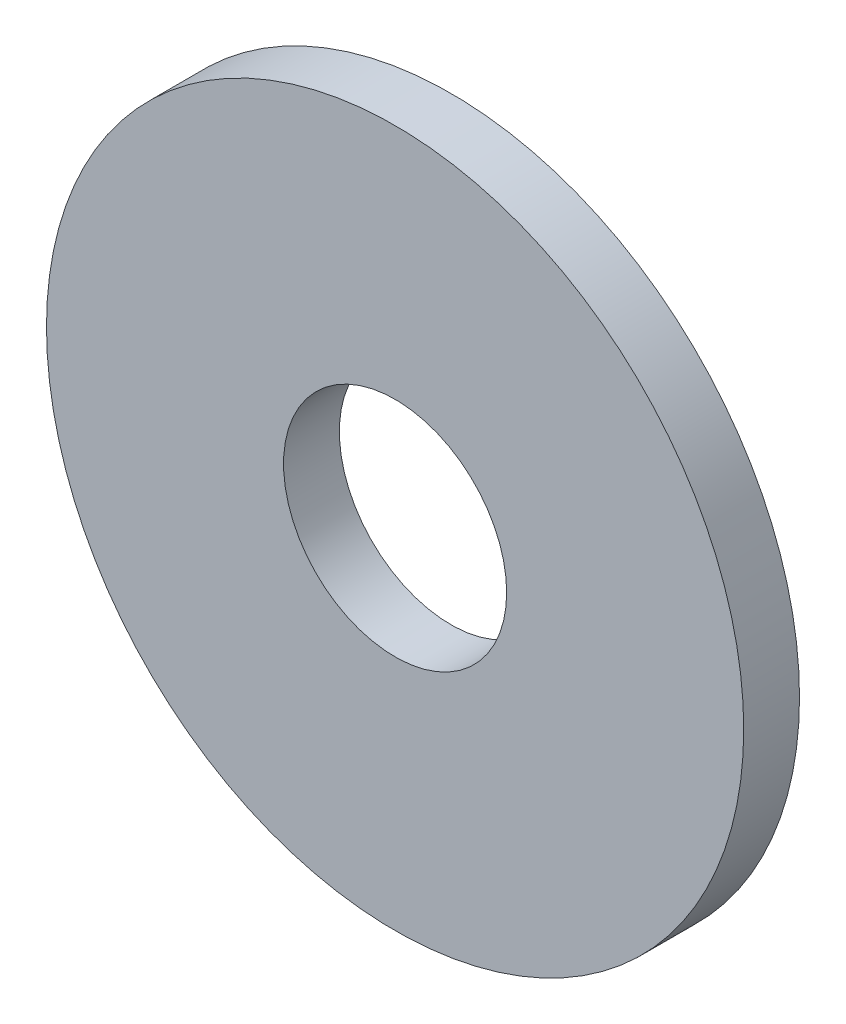
ISO-10303-21;
HEADER;
FILE_DESCRIPTION(('STEP AP214'),'2;1');
FILE_NAME('part.step','',(''),(''),'','','');
FILE_SCHEMA(('AUTOMOTIVE_DESIGN { 1 0 10303 214 1 1 1 1 }'));
ENDSEC;
DATA;
#1=APPLICATION_CONTEXT('core data for automotive mechanical design processes');
#2=APPLICATION_PROTOCOL_DEFINITION('international standard','automotive_design',2000,#1);
#3=PRODUCT_CONTEXT('',#1,'mechanical');
#4=PRODUCT('Part','Part','',(#3));
#5=PRODUCT_RELATED_PRODUCT_CATEGORY('part','',(#4));
#6=PRODUCT_DEFINITION_FORMATION('','',#4);
#7=PRODUCT_DEFINITION_CONTEXT('part definition',#1,'design');
#8=PRODUCT_DEFINITION('design','',#6,#7);
#9=PRODUCT_DEFINITION_SHAPE('','',#8);
#10=(LENGTH_UNIT() NAMED_UNIT(*) SI_UNIT(.MILLI.,.METRE.));
#11=(NAMED_UNIT(*) PLANE_ANGLE_UNIT() SI_UNIT($,.RADIAN.));
#12=(NAMED_UNIT(*) SI_UNIT($,.STERADIAN.) SOLID_ANGLE_UNIT());
#13=UNCERTAINTY_MEASURE_WITH_UNIT(LENGTH_MEASURE(1.E-05),#10,'distance_accuracy_value','');
#14=(GEOMETRIC_REPRESENTATION_CONTEXT(3) GLOBAL_UNCERTAINTY_ASSIGNED_CONTEXT((#13)) GLOBAL_UNIT_ASSIGNED_CONTEXT((#10,
#11,#12)) REPRESENTATION_CONTEXT('',''));
#15=CARTESIAN_POINT('',(0.,0.,0.));
#16=DIRECTION('',(0.,0.,1.));
#17=DIRECTION('',(1.,0.,0.));
#18=AXIS2_PLACEMENT_3D('',#15,#16,#17);
#19=CARTESIAN_POINT('',(0.,0.,0.8));
#20=DIRECTION('',(0.,0.,1.));
#21=DIRECTION('',(1.,0.,0.));
#22=AXIS2_PLACEMENT_3D('',#19,#20,#21);
#23=PLANE('',#22);
#24=CARTESIAN_POINT('',(0.,0.,0.8));
#25=DIRECTION('',(0.,0.,1.));
#26=DIRECTION('',(1.,0.,0.));
#27=AXIS2_PLACEMENT_3D('',#24,#25,#26);
#28=CIRCLE('',#27,5.);
#29=CARTESIAN_POINT('',(5.,0.,0.8));
#30=VERTEX_POINT('',#29);
#31=EDGE_CURVE('E10',#30,#30,#28,.T.);
#32=ORIENTED_EDGE('',*,*,#31,.T.);
#33=EDGE_LOOP('',(#32));
#34=FACE_BOUND('',#33,.T.);
#35=CARTESIAN_POINT('',(0.,0.,0.8));
#36=DIRECTION('',(0.,0.,1.));
#37=DIRECTION('',(1.,0.,0.));
#38=AXIS2_PLACEMENT_3D('',#35,#36,#37);
#39=CIRCLE('',#38,1.6);
#40=CARTESIAN_POINT('',(1.6,0.,0.8));
#41=VERTEX_POINT('',#40);
#42=EDGE_CURVE('E48',#41,#41,#39,.T.);
#43=ORIENTED_EDGE('',*,*,#42,.F.);
#44=EDGE_LOOP('',(#43));
#45=FACE_BOUND('',#44,.T.);
#46=ADVANCED_FACE('F40',(#34,#45),#23,.T.);
#47=CARTESIAN_POINT('',(0.,0.,0.));
#48=DIRECTION('',(0.,0.,1.));
#49=DIRECTION('',(1.,0.,0.));
#50=AXIS2_PLACEMENT_3D('',#47,#48,#49);
#51=PLANE('',#50);
#52=CARTESIAN_POINT('',(0.,0.,0.));
#53=DIRECTION('',(0.,0.,1.));
#54=DIRECTION('',(1.,0.,0.));
#55=AXIS2_PLACEMENT_3D('',#52,#53,#54);
#56=CIRCLE('',#55,5.);
#57=CARTESIAN_POINT('',(5.,0.,0.));
#58=VERTEX_POINT('',#57);
#59=EDGE_CURVE('E41',#58,#58,#56,.T.);
#60=ORIENTED_EDGE('',*,*,#59,.F.);
#61=EDGE_LOOP('',(#60));
#62=FACE_BOUND('',#61,.T.);
#63=CARTESIAN_POINT('',(0.,0.,0.));
#64=DIRECTION('',(0.,0.,1.));
#65=DIRECTION('',(1.,0.,0.));
#66=AXIS2_PLACEMENT_3D('',#63,#64,#65);
#67=CIRCLE('',#66,1.6);
#68=CARTESIAN_POINT('',(1.6,0.,0.));
#69=VERTEX_POINT('',#68);
#70=EDGE_CURVE('E49',#69,#69,#67,.T.);
#71=ORIENTED_EDGE('',*,*,#70,.T.);
#72=EDGE_LOOP('',(#71));
#73=FACE_BOUND('',#72,.T.);
#74=ADVANCED_FACE('F58',(#62,#73),#51,.F.);
#75=CARTESIAN_POINT('',(0.,0.,0.8));
#76=DIRECTION('',(0.,0.,-1.));
#77=DIRECTION('',(-1.,0.,0.));
#78=AXIS2_PLACEMENT_3D('',#75,#76,#77);
#79=CYLINDRICAL_SURFACE('',#78,5.);
#80=ORIENTED_EDGE('',*,*,#31,.F.);
#81=EDGE_LOOP('',(#80));
#82=FACE_BOUND('',#81,.T.);
#83=ORIENTED_EDGE('',*,*,#59,.T.);
#84=EDGE_LOOP('',(#83));
#85=FACE_BOUND('',#84,.T.);
#86=ADVANCED_FACE('F39',(#82,#85),#79,.T.);
#87=CARTESIAN_POINT('',(0.,0.,0.8));
#88=DIRECTION('',(0.,0.,-1.));
#89=DIRECTION('',(-1.,0.,0.));
#90=AXIS2_PLACEMENT_3D('',#87,#88,#89);
#91=CYLINDRICAL_SURFACE('',#90,1.6);
#92=ORIENTED_EDGE('',*,*,#42,.T.);
#93=EDGE_LOOP('',(#92));
#94=FACE_BOUND('',#93,.T.);
#95=ORIENTED_EDGE('',*,*,#70,.F.);
#96=EDGE_LOOP('',(#95));
#97=FACE_BOUND('',#96,.T.);
#98=ADVANCED_FACE('F57',(#94,#97),#91,.F.);
#99=CLOSED_SHELL('',(#46,#74,#86,#98));
#100=MANIFOLD_SOLID_BREP('B2',#99);
#101=ADVANCED_BREP_SHAPE_REPRESENTATION('',(#18,#100),#14);
#102=SHAPE_DEFINITION_REPRESENTATION(#9,#101);
ENDSEC;
END-ISO-10303-21;
